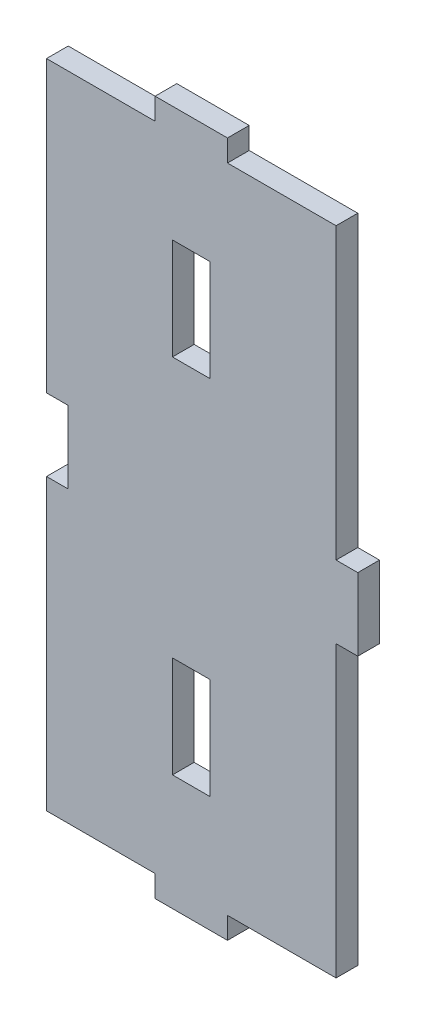
ISO-10303-21;
HEADER;
FILE_DESCRIPTION(('STEP AP214'),'2;1');
FILE_NAME('part.step','',(''),(''),'','','');
FILE_SCHEMA(('AUTOMOTIVE_DESIGN { 1 0 10303 214 1 1 1 1 }'));
ENDSEC;
DATA;
#1=APPLICATION_CONTEXT('core data for automotive mechanical design processes');
#2=APPLICATION_PROTOCOL_DEFINITION('international standard','automotive_design',2000,#1);
#3=PRODUCT_CONTEXT('',#1,'mechanical');
#4=PRODUCT('Part','Part','',(#3));
#5=PRODUCT_RELATED_PRODUCT_CATEGORY('part','',(#4));
#6=PRODUCT_DEFINITION_FORMATION('','',#4);
#7=PRODUCT_DEFINITION_CONTEXT('part definition',#1,'design');
#8=PRODUCT_DEFINITION('design','',#6,#7);
#9=PRODUCT_DEFINITION_SHAPE('','',#8);
#10=(LENGTH_UNIT() NAMED_UNIT(*) SI_UNIT(.MILLI.,.METRE.));
#11=(NAMED_UNIT(*) PLANE_ANGLE_UNIT() SI_UNIT($,.RADIAN.));
#12=(NAMED_UNIT(*) SI_UNIT($,.STERADIAN.) SOLID_ANGLE_UNIT());
#13=UNCERTAINTY_MEASURE_WITH_UNIT(LENGTH_MEASURE(1.E-05),#10,'distance_accuracy_value','');
#14=(GEOMETRIC_REPRESENTATION_CONTEXT(3) GLOBAL_UNCERTAINTY_ASSIGNED_CONTEXT((#13)) GLOBAL_UNIT_ASSIGNED_CONTEXT((#10,
#11,#12)) REPRESENTATION_CONTEXT('',''));
#15=CARTESIAN_POINT('',(0.,0.,0.));
#16=DIRECTION('',(0.,0.,1.));
#17=DIRECTION('',(1.,0.,0.));
#18=AXIS2_PLACEMENT_3D('',#15,#16,#17);
#19=CARTESIAN_POINT('',(0.,0.,3.));
#20=DIRECTION('',(0.,0.,-1.));
#21=DIRECTION('',(-1.,0.,0.));
#22=AXIS2_PLACEMENT_3D('',#19,#20,#21);
#23=PLANE('',#22);
#24=DIRECTION('',(0.,-1.,0.));
#25=VECTOR('',#24,1.);
#26=CARTESIAN_POINT('',(17.4000000000214,-17.8029528189074,3.));
#27=LINE('',#26,#25);
#28=CARTESIAN_POINT('',(17.4000000000214,-17.8029528189074,3.));
#29=VERTEX_POINT('',#28);
#30=CARTESIAN_POINT('',(17.4000000000214,-31.8029528189074,3.));
#31=VERTEX_POINT('',#30);
#32=EDGE_CURVE('E258',#29,#31,#27,.T.);
#33=ORIENTED_EDGE('',*,*,#32,.F.);
#34=DIRECTION('',(-1.,0.,0.));
#35=VECTOR('',#34,1.);
#36=CARTESIAN_POINT('',(17.4000000000214,-17.8029528189074,3.));
#37=LINE('',#36,#35);
#38=CARTESIAN_POINT('',(22.6000000000214,-17.8029528189074,3.));
#39=VERTEX_POINT('',#38);
#40=EDGE_CURVE('E266',#39,#29,#37,.T.);
#41=ORIENTED_EDGE('',*,*,#40,.F.);
#42=DIRECTION('',(0.,1.,0.));
#43=VECTOR('',#42,1.);
#44=CARTESIAN_POINT('',(22.6000000000214,-17.8029528189074,3.));
#45=LINE('',#44,#43);
#46=CARTESIAN_POINT('',(22.6000000000213,-31.8029528189074,3.));
#47=VERTEX_POINT('',#46);
#48=EDGE_CURVE('E263',#47,#39,#45,.T.);
#49=ORIENTED_EDGE('',*,*,#48,.F.);
#50=DIRECTION('',(1.,0.,0.));
#51=VECTOR('',#50,1.);
#52=CARTESIAN_POINT('',(17.4000000000214,-31.8029528189074,3.));
#53=LINE('',#52,#51);
#54=EDGE_CURVE('E260',#31,#47,#53,.T.);
#55=ORIENTED_EDGE('',*,*,#54,.F.);
#56=EDGE_LOOP('',(#33,#41,#49,#55));
#57=FACE_BOUND('',#56,.T.);
#58=DIRECTION('',(0.,-1.,0.));
#59=VECTOR('',#58,1.);
#60=CARTESIAN_POINT('',(2.13730942666412E-11,5.19704718109264,3.));
#61=LINE('',#60,#59);
#62=CARTESIAN_POINT('',(2.13730942666412E-11,45.1970471810926,3.));
#63=VERTEX_POINT('',#62);
#64=CARTESIAN_POINT('',(2.13730942666412E-11,5.19704718109264,3.));
#65=VERTEX_POINT('',#64);
#66=EDGE_CURVE('E289',#63,#65,#61,.T.);
#67=ORIENTED_EDGE('',*,*,#66,.T.);
#68=DIRECTION('',(1.,0.,0.));
#69=VECTOR('',#68,1.);
#70=CARTESIAN_POINT('',(3.00000000002137,5.19704718109264,3.));
#71=LINE('',#70,#69);
#72=CARTESIAN_POINT('',(3.00000000002137,5.19704718109264,3.));
#73=VERTEX_POINT('',#72);
#74=EDGE_CURVE('E292',#65,#73,#71,.T.);
#75=ORIENTED_EDGE('',*,*,#74,.T.);
#76=DIRECTION('',(0.,-1.,0.));
#77=VECTOR('',#76,1.);
#78=CARTESIAN_POINT('',(3.00000000002137,-4.80295281890736,3.));
#79=LINE('',#78,#77);
#80=CARTESIAN_POINT('',(3.00000000002137,-4.80295281890736,3.));
#81=VERTEX_POINT('',#80);
#82=EDGE_CURVE('E295',#73,#81,#79,.T.);
#83=ORIENTED_EDGE('',*,*,#82,.T.);
#84=DIRECTION('',(-1.,0.,0.));
#85=VECTOR('',#84,1.);
#86=CARTESIAN_POINT('',(2.13730942666412E-11,-4.80295281890736,3.));
#87=LINE('',#86,#85);
#88=CARTESIAN_POINT('',(2.13730942666412E-11,-4.80295281890736,3.));
#89=VERTEX_POINT('',#88);
#90=EDGE_CURVE('E297',#81,#89,#87,.T.);
#91=ORIENTED_EDGE('',*,*,#90,.T.);
#92=DIRECTION('',(0.,-1.,0.));
#93=VECTOR('',#92,1.);
#94=CARTESIAN_POINT('',(2.13730942666412E-11,-44.8029528189074,3.));
#95=LINE('',#94,#93);
#96=CARTESIAN_POINT('',(2.13730942666412E-11,-44.8029528189074,3.));
#97=VERTEX_POINT('',#96);
#98=EDGE_CURVE('E299',#89,#97,#95,.T.);
#99=ORIENTED_EDGE('',*,*,#98,.T.);
#100=DIRECTION('',(1.,0.,0.));
#101=VECTOR('',#100,1.);
#102=CARTESIAN_POINT('',(15.0000000000214,-44.8029528189074,3.));
#103=LINE('',#102,#101);
#104=CARTESIAN_POINT('',(15.0000000000214,-44.8029528189074,3.));
#105=VERTEX_POINT('',#104);
#106=EDGE_CURVE('E301',#97,#105,#103,.T.);
#107=ORIENTED_EDGE('',*,*,#106,.T.);
#108=DIRECTION('',(0.,-1.,0.));
#109=VECTOR('',#108,1.);
#110=CARTESIAN_POINT('',(15.0000000000214,-44.8029528189074,3.));
#111=LINE('',#110,#109);
#112=CARTESIAN_POINT('',(15.0000000000214,-47.8029528189074,3.));
#113=VERTEX_POINT('',#112);
#114=EDGE_CURVE('E303',#105,#113,#111,.T.);
#115=ORIENTED_EDGE('',*,*,#114,.T.);
#116=DIRECTION('',(1.,0.,0.));
#117=VECTOR('',#116,1.);
#118=CARTESIAN_POINT('',(15.0000000000214,-47.8029528189074,3.));
#119=LINE('',#118,#117);
#120=CARTESIAN_POINT('',(25.0000000000214,-47.8029528189074,3.));
#121=VERTEX_POINT('',#120);
#122=EDGE_CURVE('E305',#113,#121,#119,.T.);
#123=ORIENTED_EDGE('',*,*,#122,.T.);
#124=DIRECTION('',(0.,1.,0.));
#125=VECTOR('',#124,1.);
#126=CARTESIAN_POINT('',(25.0000000000214,-44.8029528189074,3.));
#127=LINE('',#126,#125);
#128=CARTESIAN_POINT('',(25.0000000000214,-44.8029528189074,3.));
#129=VERTEX_POINT('',#128);
#130=EDGE_CURVE('E307',#121,#129,#127,.T.);
#131=ORIENTED_EDGE('',*,*,#130,.T.);
#132=DIRECTION('',(1.,0.,0.));
#133=VECTOR('',#132,1.);
#134=CARTESIAN_POINT('',(40.0000000000214,-44.8029528189074,3.));
#135=LINE('',#134,#133);
#136=CARTESIAN_POINT('',(40.0000000000214,-44.8029528189074,3.));
#137=VERTEX_POINT('',#136);
#138=EDGE_CURVE('E309',#129,#137,#135,.T.);
#139=ORIENTED_EDGE('',*,*,#138,.T.);
#140=DIRECTION('',(0.,1.,0.));
#141=VECTOR('',#140,1.);
#142=CARTESIAN_POINT('',(40.0000000000214,-4.80295281890738,3.));
#143=LINE('',#142,#141);
#144=CARTESIAN_POINT('',(40.0000000000214,-4.80295281890738,3.));
#145=VERTEX_POINT('',#144);
#146=EDGE_CURVE('E311',#137,#145,#143,.T.);
#147=ORIENTED_EDGE('',*,*,#146,.T.);
#148=DIRECTION('',(1.,0.,0.));
#149=VECTOR('',#148,1.);
#150=CARTESIAN_POINT('',(40.0000000000214,-4.80295281890738,3.));
#151=LINE('',#150,#149);
#152=CARTESIAN_POINT('',(43.0000000000214,-4.80295281890738,3.));
#153=VERTEX_POINT('',#152);
#154=EDGE_CURVE('E313',#145,#153,#151,.T.);
#155=ORIENTED_EDGE('',*,*,#154,.T.);
#156=DIRECTION('',(0.,1.,0.));
#157=VECTOR('',#156,1.);
#158=CARTESIAN_POINT('',(43.0000000000214,-4.80295281890738,3.));
#159=LINE('',#158,#157);
#160=CARTESIAN_POINT('',(43.0000000000214,5.19704718109262,3.));
#161=VERTEX_POINT('',#160);
#162=EDGE_CURVE('E315',#153,#161,#159,.T.);
#163=ORIENTED_EDGE('',*,*,#162,.T.);
#164=DIRECTION('',(-1.,0.,0.));
#165=VECTOR('',#164,1.);
#166=CARTESIAN_POINT('',(40.0000000000214,5.19704718109262,3.));
#167=LINE('',#166,#165);
#168=CARTESIAN_POINT('',(40.0000000000214,5.19704718109262,3.));
#169=VERTEX_POINT('',#168);
#170=EDGE_CURVE('E317',#161,#169,#167,.T.);
#171=ORIENTED_EDGE('',*,*,#170,.T.);
#172=DIRECTION('',(0.,1.,0.));
#173=VECTOR('',#172,1.);
#174=CARTESIAN_POINT('',(40.0000000000214,45.1970471810926,3.));
#175=LINE('',#174,#173);
#176=CARTESIAN_POINT('',(40.0000000000214,45.1970471810926,3.));
#177=VERTEX_POINT('',#176);
#178=EDGE_CURVE('E319',#169,#177,#175,.T.);
#179=ORIENTED_EDGE('',*,*,#178,.T.);
#180=DIRECTION('',(-1.,0.,0.));
#181=VECTOR('',#180,1.);
#182=CARTESIAN_POINT('',(25.0000000000214,45.1970471810926,3.));
#183=LINE('',#182,#181);
#184=CARTESIAN_POINT('',(25.0000000000214,45.1970471810926,3.));
#185=VERTEX_POINT('',#184);
#186=EDGE_CURVE('E321',#177,#185,#183,.T.);
#187=ORIENTED_EDGE('',*,*,#186,.T.);
#188=DIRECTION('',(0.,1.,0.));
#189=VECTOR('',#188,1.);
#190=CARTESIAN_POINT('',(25.0000000000214,45.1970471810926,3.));
#191=LINE('',#190,#189);
#192=CARTESIAN_POINT('',(25.0000000000214,48.1970471810926,3.));
#193=VERTEX_POINT('',#192);
#194=EDGE_CURVE('E323',#185,#193,#191,.T.);
#195=ORIENTED_EDGE('',*,*,#194,.T.);
#196=DIRECTION('',(-1.,0.,0.));
#197=VECTOR('',#196,1.);
#198=CARTESIAN_POINT('',(15.0000000000214,48.1970471810926,3.));
#199=LINE('',#198,#197);
#200=CARTESIAN_POINT('',(15.0000000000214,48.1970471810926,3.));
#201=VERTEX_POINT('',#200);
#202=EDGE_CURVE('E325',#193,#201,#199,.T.);
#203=ORIENTED_EDGE('',*,*,#202,.T.);
#204=DIRECTION('',(0.,-1.,0.));
#205=VECTOR('',#204,1.);
#206=CARTESIAN_POINT('',(15.0000000000214,45.1970471810926,3.));
#207=LINE('',#206,#205);
#208=CARTESIAN_POINT('',(15.0000000000214,45.1970471810926,3.));
#209=VERTEX_POINT('',#208);
#210=EDGE_CURVE('E327',#201,#209,#207,.T.);
#211=ORIENTED_EDGE('',*,*,#210,.T.);
#212=DIRECTION('',(-1.,0.,0.));
#213=VECTOR('',#212,1.);
#214=CARTESIAN_POINT('',(2.13730942666412E-11,45.1970471810926,3.));
#215=LINE('',#214,#213);
#216=EDGE_CURVE('E329',#209,#63,#215,.T.);
#217=ORIENTED_EDGE('',*,*,#216,.T.);
#218=EDGE_LOOP('',(#67,#75,#83,#91,#99,#107,#115,#123,#131,#139,#147,#155,#163,#171,#179,#187,
#195,#203,#211,#217));
#219=FACE_BOUND('',#218,.T.);
#220=DIRECTION('',(0.,1.,0.));
#221=VECTOR('',#220,1.);
#222=CARTESIAN_POINT('',(22.6000000000214,18.1970471810926,3.));
#223=LINE('',#222,#221);
#224=CARTESIAN_POINT('',(22.6000000000214,18.1970471810926,3.));
#225=VERTEX_POINT('',#224);
#226=CARTESIAN_POINT('',(22.6000000000214,32.1970471810926,3.));
#227=VERTEX_POINT('',#226);
#228=EDGE_CURVE('E222',#225,#227,#223,.T.);
#229=ORIENTED_EDGE('',*,*,#228,.F.);
#230=DIRECTION('',(1.,0.,0.));
#231=VECTOR('',#230,1.);
#232=CARTESIAN_POINT('',(17.4000000000214,18.1970471810926,3.));
#233=LINE('',#232,#231);
#234=CARTESIAN_POINT('',(17.4000000000214,18.1970471810926,3.));
#235=VERTEX_POINT('',#234);
#236=EDGE_CURVE('E244',#235,#225,#233,.T.);
#237=ORIENTED_EDGE('',*,*,#236,.F.);
#238=DIRECTION('',(0.,-1.,0.));
#239=VECTOR('',#238,1.);
#240=CARTESIAN_POINT('',(17.4000000000214,18.1970471810926,3.));
#241=LINE('',#240,#239);
#242=CARTESIAN_POINT('',(17.4000000000214,32.1970471810926,3.));
#243=VERTEX_POINT('',#242);
#244=EDGE_CURVE('E242',#243,#235,#241,.T.);
#245=ORIENTED_EDGE('',*,*,#244,.F.);
#246=DIRECTION('',(-1.,0.,0.));
#247=VECTOR('',#246,1.);
#248=CARTESIAN_POINT('',(17.4000000000214,32.1970471810926,3.));
#249=LINE('',#248,#247);
#250=EDGE_CURVE('E230',#227,#243,#249,.T.);
#251=ORIENTED_EDGE('',*,*,#250,.F.);
#252=EDGE_LOOP('',(#229,#237,#245,#251));
#253=FACE_BOUND('',#252,.T.);
#254=ADVANCED_FACE('F37',(#57,#219,#253),#23,.F.);
#255=CARTESIAN_POINT('',(0.,0.,0.));
#256=DIRECTION('',(0.,0.,-1.));
#257=DIRECTION('',(-1.,0.,0.));
#258=AXIS2_PLACEMENT_3D('',#255,#256,#257);
#259=PLANE('',#258);
#260=DIRECTION('',(0.,-1.,0.));
#261=VECTOR('',#260,1.);
#262=CARTESIAN_POINT('',(2.13730942666412E-11,5.19704718109264,0.));
#263=LINE('',#262,#261);
#264=CARTESIAN_POINT('',(2.13730942666412E-11,45.1970471810926,0.));
#265=VERTEX_POINT('',#264);
#266=CARTESIAN_POINT('',(2.13730942666412E-11,5.19704718109264,0.));
#267=VERTEX_POINT('',#266);
#268=EDGE_CURVE('E288',#265,#267,#263,.T.);
#269=ORIENTED_EDGE('',*,*,#268,.F.);
#270=DIRECTION('',(-1.,0.,0.));
#271=VECTOR('',#270,1.);
#272=CARTESIAN_POINT('',(2.13730942666412E-11,45.1970471810926,0.));
#273=LINE('',#272,#271);
#274=CARTESIAN_POINT('',(15.0000000000214,45.1970471810926,0.));
#275=VERTEX_POINT('',#274);
#276=EDGE_CURVE('E293',#275,#265,#273,.T.);
#277=ORIENTED_EDGE('',*,*,#276,.F.);
#278=DIRECTION('',(0.,-1.,0.));
#279=VECTOR('',#278,1.);
#280=CARTESIAN_POINT('',(15.0000000000214,45.1970471810926,0.));
#281=LINE('',#280,#279);
#282=CARTESIAN_POINT('',(15.0000000000214,48.1970471810926,0.));
#283=VERTEX_POINT('',#282);
#284=EDGE_CURVE('E368',#283,#275,#281,.T.);
#285=ORIENTED_EDGE('',*,*,#284,.F.);
#286=DIRECTION('',(-1.,0.,0.));
#287=VECTOR('',#286,1.);
#288=CARTESIAN_POINT('',(15.0000000000214,48.1970471810926,0.));
#289=LINE('',#288,#287);
#290=CARTESIAN_POINT('',(25.0000000000214,48.1970471810926,0.));
#291=VERTEX_POINT('',#290);
#292=EDGE_CURVE('E366',#291,#283,#289,.T.);
#293=ORIENTED_EDGE('',*,*,#292,.F.);
#294=DIRECTION('',(0.,1.,0.));
#295=VECTOR('',#294,1.);
#296=CARTESIAN_POINT('',(25.0000000000214,45.1970471810926,0.));
#297=LINE('',#296,#295);
#298=CARTESIAN_POINT('',(25.0000000000214,45.1970471810926,0.));
#299=VERTEX_POINT('',#298);
#300=EDGE_CURVE('E364',#299,#291,#297,.T.);
#301=ORIENTED_EDGE('',*,*,#300,.F.);
#302=DIRECTION('',(-1.,0.,0.));
#303=VECTOR('',#302,1.);
#304=CARTESIAN_POINT('',(25.0000000000214,45.1970471810926,0.));
#305=LINE('',#304,#303);
#306=CARTESIAN_POINT('',(40.0000000000214,45.1970471810926,0.));
#307=VERTEX_POINT('',#306);
#308=EDGE_CURVE('E362',#307,#299,#305,.T.);
#309=ORIENTED_EDGE('',*,*,#308,.F.);
#310=DIRECTION('',(0.,1.,0.));
#311=VECTOR('',#310,1.);
#312=CARTESIAN_POINT('',(40.0000000000214,45.1970471810926,0.));
#313=LINE('',#312,#311);
#314=CARTESIAN_POINT('',(40.0000000000214,5.19704718109262,0.));
#315=VERTEX_POINT('',#314);
#316=EDGE_CURVE('E360',#315,#307,#313,.T.);
#317=ORIENTED_EDGE('',*,*,#316,.F.);
#318=DIRECTION('',(-1.,0.,0.));
#319=VECTOR('',#318,1.);
#320=CARTESIAN_POINT('',(40.0000000000214,5.19704718109262,0.));
#321=LINE('',#320,#319);
#322=CARTESIAN_POINT('',(43.0000000000214,5.19704718109262,0.));
#323=VERTEX_POINT('',#322);
#324=EDGE_CURVE('E358',#323,#315,#321,.T.);
#325=ORIENTED_EDGE('',*,*,#324,.F.);
#326=DIRECTION('',(0.,1.,0.));
#327=VECTOR('',#326,1.);
#328=CARTESIAN_POINT('',(43.0000000000214,-4.80295281890738,0.));
#329=LINE('',#328,#327);
#330=CARTESIAN_POINT('',(43.0000000000214,-4.80295281890738,0.));
#331=VERTEX_POINT('',#330);
#332=EDGE_CURVE('E356',#331,#323,#329,.T.);
#333=ORIENTED_EDGE('',*,*,#332,.F.);
#334=DIRECTION('',(1.,0.,0.));
#335=VECTOR('',#334,1.);
#336=CARTESIAN_POINT('',(40.0000000000214,-4.80295281890738,0.));
#337=LINE('',#336,#335);
#338=CARTESIAN_POINT('',(40.0000000000214,-4.80295281890738,0.));
#339=VERTEX_POINT('',#338);
#340=EDGE_CURVE('E354',#339,#331,#337,.T.);
#341=ORIENTED_EDGE('',*,*,#340,.F.);
#342=DIRECTION('',(0.,1.,0.));
#343=VECTOR('',#342,1.);
#344=CARTESIAN_POINT('',(40.0000000000214,-4.80295281890738,0.));
#345=LINE('',#344,#343);
#346=CARTESIAN_POINT('',(40.0000000000214,-44.8029528189074,0.));
#347=VERTEX_POINT('',#346);
#348=EDGE_CURVE('E352',#347,#339,#345,.T.);
#349=ORIENTED_EDGE('',*,*,#348,.F.);
#350=DIRECTION('',(1.,0.,0.));
#351=VECTOR('',#350,1.);
#352=CARTESIAN_POINT('',(40.0000000000214,-44.8029528189074,0.));
#353=LINE('',#352,#351);
#354=CARTESIAN_POINT('',(25.0000000000214,-44.8029528189074,0.));
#355=VERTEX_POINT('',#354);
#356=EDGE_CURVE('E350',#355,#347,#353,.T.);
#357=ORIENTED_EDGE('',*,*,#356,.F.);
#358=DIRECTION('',(0.,1.,0.));
#359=VECTOR('',#358,1.);
#360=CARTESIAN_POINT('',(25.0000000000214,-44.8029528189074,0.));
#361=LINE('',#360,#359);
#362=CARTESIAN_POINT('',(25.0000000000214,-47.8029528189074,0.));
#363=VERTEX_POINT('',#362);
#364=EDGE_CURVE('E348',#363,#355,#361,.T.);
#365=ORIENTED_EDGE('',*,*,#364,.F.);
#366=DIRECTION('',(1.,0.,0.));
#367=VECTOR('',#366,1.);
#368=CARTESIAN_POINT('',(15.0000000000214,-47.8029528189074,0.));
#369=LINE('',#368,#367);
#370=CARTESIAN_POINT('',(15.0000000000214,-47.8029528189074,0.));
#371=VERTEX_POINT('',#370);
#372=EDGE_CURVE('E346',#371,#363,#369,.T.);
#373=ORIENTED_EDGE('',*,*,#372,.F.);
#374=DIRECTION('',(0.,-1.,0.));
#375=VECTOR('',#374,1.);
#376=CARTESIAN_POINT('',(15.0000000000214,-44.8029528189074,0.));
#377=LINE('',#376,#375);
#378=CARTESIAN_POINT('',(15.0000000000214,-44.8029528189074,0.));
#379=VERTEX_POINT('',#378);
#380=EDGE_CURVE('E344',#379,#371,#377,.T.);
#381=ORIENTED_EDGE('',*,*,#380,.F.);
#382=DIRECTION('',(1.,0.,0.));
#383=VECTOR('',#382,1.);
#384=CARTESIAN_POINT('',(15.0000000000214,-44.8029528189074,0.));
#385=LINE('',#384,#383);
#386=CARTESIAN_POINT('',(2.13730942666412E-11,-44.8029528189074,0.));
#387=VERTEX_POINT('',#386);
#388=EDGE_CURVE('E342',#387,#379,#385,.T.);
#389=ORIENTED_EDGE('',*,*,#388,.F.);
#390=DIRECTION('',(0.,-1.,0.));
#391=VECTOR('',#390,1.);
#392=CARTESIAN_POINT('',(2.13730942666412E-11,-44.8029528189074,0.));
#393=LINE('',#392,#391);
#394=CARTESIAN_POINT('',(2.13730942666412E-11,-4.80295281890736,0.));
#395=VERTEX_POINT('',#394);
#396=EDGE_CURVE('E340',#395,#387,#393,.T.);
#397=ORIENTED_EDGE('',*,*,#396,.F.);
#398=DIRECTION('',(-1.,0.,0.));
#399=VECTOR('',#398,1.);
#400=CARTESIAN_POINT('',(2.13730942666412E-11,-4.80295281890736,0.));
#401=LINE('',#400,#399);
#402=CARTESIAN_POINT('',(3.00000000002137,-4.80295281890736,0.));
#403=VERTEX_POINT('',#402);
#404=EDGE_CURVE('E338',#403,#395,#401,.T.);
#405=ORIENTED_EDGE('',*,*,#404,.F.);
#406=DIRECTION('',(0.,-1.,0.));
#407=VECTOR('',#406,1.);
#408=CARTESIAN_POINT('',(3.00000000002137,-4.80295281890736,0.));
#409=LINE('',#408,#407);
#410=CARTESIAN_POINT('',(3.00000000002137,5.19704718109264,0.));
#411=VERTEX_POINT('',#410);
#412=EDGE_CURVE('E336',#411,#403,#409,.T.);
#413=ORIENTED_EDGE('',*,*,#412,.F.);
#414=DIRECTION('',(1.,0.,0.));
#415=VECTOR('',#414,1.);
#416=CARTESIAN_POINT('',(3.00000000002137,5.19704718109264,0.));
#417=LINE('',#416,#415);
#418=EDGE_CURVE('E334',#267,#411,#417,.T.);
#419=ORIENTED_EDGE('',*,*,#418,.F.);
#420=EDGE_LOOP('',(#269,#277,#285,#293,#301,#309,#317,#325,#333,#341,#349,#357,#365,#373,#381,
#389,#397,#405,#413,#419));
#421=FACE_BOUND('',#420,.T.);
#422=DIRECTION('',(-1.,0.,0.));
#423=VECTOR('',#422,1.);
#424=CARTESIAN_POINT('',(17.4000000000214,-17.8029528189074,0.));
#425=LINE('',#424,#423);
#426=CARTESIAN_POINT('',(22.6000000000214,-17.8029528189074,0.));
#427=VERTEX_POINT('',#426);
#428=CARTESIAN_POINT('',(17.4000000000214,-17.8029528189074,0.));
#429=VERTEX_POINT('',#428);
#430=EDGE_CURVE('E261',#427,#429,#425,.T.);
#431=ORIENTED_EDGE('',*,*,#430,.T.);
#432=DIRECTION('',(0.,-1.,0.));
#433=VECTOR('',#432,1.);
#434=CARTESIAN_POINT('',(17.4000000000214,-17.8029528189074,0.));
#435=LINE('',#434,#433);
#436=CARTESIAN_POINT('',(17.4000000000214,-31.8029528189074,0.));
#437=VERTEX_POINT('',#436);
#438=EDGE_CURVE('E238',#429,#437,#435,.T.);
#439=ORIENTED_EDGE('',*,*,#438,.T.);
#440=DIRECTION('',(1.,0.,0.));
#441=VECTOR('',#440,1.);
#442=CARTESIAN_POINT('',(17.4000000000214,-31.8029528189074,0.));
#443=LINE('',#442,#441);
#444=CARTESIAN_POINT('',(22.6000000000213,-31.8029528189074,0.));
#445=VERTEX_POINT('',#444);
#446=EDGE_CURVE('E271',#437,#445,#443,.T.);
#447=ORIENTED_EDGE('',*,*,#446,.T.);
#448=DIRECTION('',(0.,1.,0.));
#449=VECTOR('',#448,1.);
#450=CARTESIAN_POINT('',(22.6000000000214,-17.8029528189074,0.));
#451=LINE('',#450,#449);
#452=EDGE_CURVE('E274',#445,#427,#451,.T.);
#453=ORIENTED_EDGE('',*,*,#452,.T.);
#454=EDGE_LOOP('',(#431,#439,#447,#453));
#455=FACE_BOUND('',#454,.T.);
#456=DIRECTION('',(1.,0.,0.));
#457=VECTOR('',#456,1.);
#458=CARTESIAN_POINT('',(17.4000000000214,18.1970471810926,0.));
#459=LINE('',#458,#457);
#460=CARTESIAN_POINT('',(17.4000000000214,18.1970471810926,0.));
#461=VERTEX_POINT('',#460);
#462=CARTESIAN_POINT('',(22.6000000000214,18.1970471810926,0.));
#463=VERTEX_POINT('',#462);
#464=EDGE_CURVE('E231',#461,#463,#459,.T.);
#465=ORIENTED_EDGE('',*,*,#464,.T.);
#466=DIRECTION('',(0.,1.,0.));
#467=VECTOR('',#466,1.);
#468=CARTESIAN_POINT('',(22.6000000000214,18.1970471810926,0.));
#469=LINE('',#468,#467);
#470=CARTESIAN_POINT('',(22.6000000000214,32.1970471810926,0.));
#471=VERTEX_POINT('',#470);
#472=EDGE_CURVE('E60',#463,#471,#469,.T.);
#473=ORIENTED_EDGE('',*,*,#472,.T.);
#474=DIRECTION('',(-1.,0.,0.));
#475=VECTOR('',#474,1.);
#476=CARTESIAN_POINT('',(17.4000000000214,32.1970471810926,0.));
#477=LINE('',#476,#475);
#478=CARTESIAN_POINT('',(17.4000000000214,32.1970471810926,0.));
#479=VERTEX_POINT('',#478);
#480=EDGE_CURVE('E237',#471,#479,#477,.T.);
#481=ORIENTED_EDGE('',*,*,#480,.T.);
#482=DIRECTION('',(0.,-1.,0.));
#483=VECTOR('',#482,1.);
#484=CARTESIAN_POINT('',(17.4000000000214,18.1970471810926,0.));
#485=LINE('',#484,#483);
#486=EDGE_CURVE('E250',#479,#461,#485,.T.);
#487=ORIENTED_EDGE('',*,*,#486,.T.);
#488=EDGE_LOOP('',(#465,#473,#481,#487));
#489=FACE_BOUND('',#488,.T.);
#490=ADVANCED_FACE('F434',(#421,#455,#489),#259,.T.);
#491=CARTESIAN_POINT('',(2.13730942666412E-11,5.19704718109264,3.));
#492=DIRECTION('',(1.,0.,0.));
#493=DIRECTION('',(0.,0.,-1.));
#494=AXIS2_PLACEMENT_3D('',#491,#492,#493);
#495=PLANE('',#494);
#496=ORIENTED_EDGE('',*,*,#268,.T.);
#497=DIRECTION('',(0.,0.,-1.));
#498=VECTOR('',#497,1.);
#499=CARTESIAN_POINT('',(2.13730942666412E-11,5.19704718109264,3.));
#500=LINE('',#499,#498);
#501=EDGE_CURVE('E11',#65,#267,#500,.T.);
#502=ORIENTED_EDGE('',*,*,#501,.F.);
#503=ORIENTED_EDGE('',*,*,#66,.F.);
#504=DIRECTION('',(0.,0.,-1.));
#505=VECTOR('',#504,1.);
#506=CARTESIAN_POINT('',(2.13730942666412E-11,45.1970471810926,3.));
#507=LINE('',#506,#505);
#508=EDGE_CURVE('E331',#63,#265,#507,.T.);
#509=ORIENTED_EDGE('',*,*,#508,.T.);
#510=EDGE_LOOP('',(#496,#502,#503,#509));
#511=FACE_BOUND('',#510,.T.);
#512=ADVANCED_FACE('F39',(#511),#495,.F.);
#513=CARTESIAN_POINT('',(3.00000000002137,5.19704718109264,3.));
#514=DIRECTION('',(0.,1.,0.));
#515=DIRECTION('',(0.,0.,1.));
#516=AXIS2_PLACEMENT_3D('',#513,#514,#515);
#517=PLANE('',#516);
#518=ORIENTED_EDGE('',*,*,#418,.T.);
#519=DIRECTION('',(0.,0.,-1.));
#520=VECTOR('',#519,1.);
#521=CARTESIAN_POINT('',(3.00000000002137,5.19704718109264,3.));
#522=LINE('',#521,#520);
#523=EDGE_CURVE('E45',#73,#411,#522,.T.);
#524=ORIENTED_EDGE('',*,*,#523,.F.);
#525=ORIENTED_EDGE('',*,*,#74,.F.);
#526=ORIENTED_EDGE('',*,*,#501,.T.);
#527=EDGE_LOOP('',(#518,#524,#525,#526));
#528=FACE_BOUND('',#527,.T.);
#529=ADVANCED_FACE('F451',(#528),#517,.F.);
#530=CARTESIAN_POINT('',(3.00000000002137,-4.80295281890736,3.));
#531=DIRECTION('',(1.,0.,0.));
#532=DIRECTION('',(0.,0.,-1.));
#533=AXIS2_PLACEMENT_3D('',#530,#531,#532);
#534=PLANE('',#533);
#535=ORIENTED_EDGE('',*,*,#412,.T.);
#536=DIRECTION('',(0.,0.,-1.));
#537=VECTOR('',#536,1.);
#538=CARTESIAN_POINT('',(3.00000000002137,-4.80295281890736,3.));
#539=LINE('',#538,#537);
#540=EDGE_CURVE('E421',#81,#403,#539,.T.);
#541=ORIENTED_EDGE('',*,*,#540,.F.);
#542=ORIENTED_EDGE('',*,*,#82,.F.);
#543=ORIENTED_EDGE('',*,*,#523,.T.);
#544=EDGE_LOOP('',(#535,#541,#542,#543));
#545=FACE_BOUND('',#544,.T.);
#546=ADVANCED_FACE('F428',(#545),#534,.F.);
#547=CARTESIAN_POINT('',(2.13730942666412E-11,-4.80295281890736,3.));
#548=DIRECTION('',(0.,-1.,0.));
#549=DIRECTION('',(1.,0.,0.));
#550=AXIS2_PLACEMENT_3D('',#547,#548,#549);
#551=PLANE('',#550);
#552=ORIENTED_EDGE('',*,*,#404,.T.);
#553=DIRECTION('',(0.,0.,-1.));
#554=VECTOR('',#553,1.);
#555=CARTESIAN_POINT('',(2.13730942666412E-11,-4.80295281890736,3.));
#556=LINE('',#555,#554);
#557=EDGE_CURVE('E418',#89,#395,#556,.T.);
#558=ORIENTED_EDGE('',*,*,#557,.F.);
#559=ORIENTED_EDGE('',*,*,#90,.F.);
#560=ORIENTED_EDGE('',*,*,#540,.T.);
#561=EDGE_LOOP('',(#552,#558,#559,#560));
#562=FACE_BOUND('',#561,.T.);
#563=ADVANCED_FACE('F440',(#562),#551,.F.);
#564=CARTESIAN_POINT('',(2.13730942666412E-11,-44.8029528189074,3.));
#565=DIRECTION('',(1.,0.,0.));
#566=DIRECTION('',(0.,0.,-1.));
#567=AXIS2_PLACEMENT_3D('',#564,#565,#566);
#568=PLANE('',#567);
#569=ORIENTED_EDGE('',*,*,#396,.T.);
#570=DIRECTION('',(0.,0.,-1.));
#571=VECTOR('',#570,1.);
#572=CARTESIAN_POINT('',(2.13730942666412E-11,-44.8029528189074,3.));
#573=LINE('',#572,#571);
#574=EDGE_CURVE('E415',#97,#387,#573,.T.);
#575=ORIENTED_EDGE('',*,*,#574,.F.);
#576=ORIENTED_EDGE('',*,*,#98,.F.);
#577=ORIENTED_EDGE('',*,*,#557,.T.);
#578=EDGE_LOOP('',(#569,#575,#576,#577));
#579=FACE_BOUND('',#578,.T.);
#580=ADVANCED_FACE('F444',(#579),#568,.F.);
#581=CARTESIAN_POINT('',(15.0000000000214,-44.8029528189074,3.));
#582=DIRECTION('',(0.,1.,0.));
#583=DIRECTION('',(-1.,0.,0.));
#584=AXIS2_PLACEMENT_3D('',#581,#582,#583);
#585=PLANE('',#584);
#586=ORIENTED_EDGE('',*,*,#388,.T.);
#587=DIRECTION('',(0.,0.,-1.));
#588=VECTOR('',#587,1.);
#589=CARTESIAN_POINT('',(15.0000000000214,-44.8029528189074,3.));
#590=LINE('',#589,#588);
#591=EDGE_CURVE('E412',#105,#379,#590,.T.);
#592=ORIENTED_EDGE('',*,*,#591,.F.);
#593=ORIENTED_EDGE('',*,*,#106,.F.);
#594=ORIENTED_EDGE('',*,*,#574,.T.);
#595=EDGE_LOOP('',(#586,#592,#593,#594));
#596=FACE_BOUND('',#595,.T.);
#597=ADVANCED_FACE('F524',(#596),#585,.F.);
#598=CARTESIAN_POINT('',(15.0000000000214,-44.8029528189074,3.));
#599=DIRECTION('',(1.,0.,0.));
#600=DIRECTION('',(0.,0.,-1.));
#601=AXIS2_PLACEMENT_3D('',#598,#599,#600);
#602=PLANE('',#601);
#603=ORIENTED_EDGE('',*,*,#380,.T.);
#604=DIRECTION('',(0.,0.,-1.));
#605=VECTOR('',#604,1.);
#606=CARTESIAN_POINT('',(15.0000000000214,-47.8029528189074,3.));
#607=LINE('',#606,#605);
#608=EDGE_CURVE('E409',#113,#371,#607,.T.);
#609=ORIENTED_EDGE('',*,*,#608,.F.);
#610=ORIENTED_EDGE('',*,*,#114,.F.);
#611=ORIENTED_EDGE('',*,*,#591,.T.);
#612=EDGE_LOOP('',(#603,#609,#610,#611));
#613=FACE_BOUND('',#612,.T.);
#614=ADVANCED_FACE('F522',(#613),#602,.F.);
#615=CARTESIAN_POINT('',(15.0000000000214,-47.8029528189074,3.));
#616=DIRECTION('',(0.,1.,0.));
#617=DIRECTION('',(0.,0.,1.));
#618=AXIS2_PLACEMENT_3D('',#615,#616,#617);
#619=PLANE('',#618);
#620=ORIENTED_EDGE('',*,*,#372,.T.);
#621=DIRECTION('',(0.,0.,-1.));
#622=VECTOR('',#621,1.);
#623=CARTESIAN_POINT('',(25.0000000000214,-47.8029528189074,3.));
#624=LINE('',#623,#622);
#625=EDGE_CURVE('E406',#121,#363,#624,.T.);
#626=ORIENTED_EDGE('',*,*,#625,.F.);
#627=ORIENTED_EDGE('',*,*,#122,.F.);
#628=ORIENTED_EDGE('',*,*,#608,.T.);
#629=EDGE_LOOP('',(#620,#626,#627,#628));
#630=FACE_BOUND('',#629,.T.);
#631=ADVANCED_FACE('F517',(#630),#619,.F.);
#632=CARTESIAN_POINT('',(25.0000000000214,-44.8029528189074,3.));
#633=DIRECTION('',(-1.,0.,0.));
#634=DIRECTION('',(0.,0.,1.));
#635=AXIS2_PLACEMENT_3D('',#632,#633,#634);
#636=PLANE('',#635);
#637=ORIENTED_EDGE('',*,*,#364,.T.);
#638=DIRECTION('',(0.,0.,-1.));
#639=VECTOR('',#638,1.);
#640=CARTESIAN_POINT('',(25.0000000000214,-44.8029528189074,3.));
#641=LINE('',#640,#639);
#642=EDGE_CURVE('E403',#129,#355,#641,.T.);
#643=ORIENTED_EDGE('',*,*,#642,.F.);
#644=ORIENTED_EDGE('',*,*,#130,.F.);
#645=ORIENTED_EDGE('',*,*,#625,.T.);
#646=EDGE_LOOP('',(#637,#643,#644,#645));
#647=FACE_BOUND('',#646,.T.);
#648=ADVANCED_FACE('F512',(#647),#636,.F.);
#649=CARTESIAN_POINT('',(40.0000000000214,-44.8029528189074,3.));
#650=DIRECTION('',(0.,1.,0.));
#651=DIRECTION('',(-1.,0.,0.));
#652=AXIS2_PLACEMENT_3D('',#649,#650,#651);
#653=PLANE('',#652);
#654=ORIENTED_EDGE('',*,*,#356,.T.);
#655=DIRECTION('',(0.,0.,-1.));
#656=VECTOR('',#655,1.);
#657=CARTESIAN_POINT('',(40.0000000000214,-44.8029528189074,3.));
#658=LINE('',#657,#656);
#659=EDGE_CURVE('E400',#137,#347,#658,.T.);
#660=ORIENTED_EDGE('',*,*,#659,.F.);
#661=ORIENTED_EDGE('',*,*,#138,.F.);
#662=ORIENTED_EDGE('',*,*,#642,.T.);
#663=EDGE_LOOP('',(#654,#660,#661,#662));
#664=FACE_BOUND('',#663,.T.);
#665=ADVANCED_FACE('F508',(#664),#653,.F.);
#666=CARTESIAN_POINT('',(40.0000000000214,-4.80295281890738,3.));
#667=DIRECTION('',(-1.,0.,0.));
#668=DIRECTION('',(0.,0.,1.));
#669=AXIS2_PLACEMENT_3D('',#666,#667,#668);
#670=PLANE('',#669);
#671=ORIENTED_EDGE('',*,*,#348,.T.);
#672=DIRECTION('',(0.,0.,-1.));
#673=VECTOR('',#672,1.);
#674=CARTESIAN_POINT('',(40.0000000000214,-4.80295281890738,3.));
#675=LINE('',#674,#673);
#676=EDGE_CURVE('E397',#145,#339,#675,.T.);
#677=ORIENTED_EDGE('',*,*,#676,.F.);
#678=ORIENTED_EDGE('',*,*,#146,.F.);
#679=ORIENTED_EDGE('',*,*,#659,.T.);
#680=EDGE_LOOP('',(#671,#677,#678,#679));
#681=FACE_BOUND('',#680,.T.);
#682=ADVANCED_FACE('F503',(#681),#670,.F.);
#683=CARTESIAN_POINT('',(40.0000000000214,-4.80295281890738,3.));
#684=DIRECTION('',(0.,1.,0.));
#685=DIRECTION('',(-1.,0.,0.));
#686=AXIS2_PLACEMENT_3D('',#683,#684,#685);
#687=PLANE('',#686);
#688=ORIENTED_EDGE('',*,*,#340,.T.);
#689=DIRECTION('',(0.,0.,-1.));
#690=VECTOR('',#689,1.);
#691=CARTESIAN_POINT('',(43.0000000000214,-4.80295281890738,3.));
#692=LINE('',#691,#690);
#693=EDGE_CURVE('E394',#153,#331,#692,.T.);
#694=ORIENTED_EDGE('',*,*,#693,.F.);
#695=ORIENTED_EDGE('',*,*,#154,.F.);
#696=ORIENTED_EDGE('',*,*,#676,.T.);
#697=EDGE_LOOP('',(#688,#694,#695,#696));
#698=FACE_BOUND('',#697,.T.);
#699=ADVANCED_FACE('F497',(#698),#687,.F.);
#700=CARTESIAN_POINT('',(43.0000000000214,-4.80295281890738,3.));
#701=DIRECTION('',(-1.,0.,0.));
#702=DIRECTION('',(0.,0.,1.));
#703=AXIS2_PLACEMENT_3D('',#700,#701,#702);
#704=PLANE('',#703);
#705=ORIENTED_EDGE('',*,*,#332,.T.);
#706=DIRECTION('',(0.,0.,-1.));
#707=VECTOR('',#706,1.);
#708=CARTESIAN_POINT('',(43.0000000000214,5.19704718109262,3.));
#709=LINE('',#708,#707);
#710=EDGE_CURVE('E391',#161,#323,#709,.T.);
#711=ORIENTED_EDGE('',*,*,#710,.F.);
#712=ORIENTED_EDGE('',*,*,#162,.F.);
#713=ORIENTED_EDGE('',*,*,#693,.T.);
#714=EDGE_LOOP('',(#705,#711,#712,#713));
#715=FACE_BOUND('',#714,.T.);
#716=ADVANCED_FACE('F493',(#715),#704,.F.);
#717=CARTESIAN_POINT('',(40.0000000000214,5.19704718109262,3.));
#718=DIRECTION('',(0.,-1.,0.));
#719=DIRECTION('',(1.,0.,0.));
#720=AXIS2_PLACEMENT_3D('',#717,#718,#719);
#721=PLANE('',#720);
#722=ORIENTED_EDGE('',*,*,#324,.T.);
#723=DIRECTION('',(0.,0.,-1.));
#724=VECTOR('',#723,1.);
#725=CARTESIAN_POINT('',(40.0000000000214,5.19704718109262,3.));
#726=LINE('',#725,#724);
#727=EDGE_CURVE('E388',#169,#315,#726,.T.);
#728=ORIENTED_EDGE('',*,*,#727,.F.);
#729=ORIENTED_EDGE('',*,*,#170,.F.);
#730=ORIENTED_EDGE('',*,*,#710,.T.);
#731=EDGE_LOOP('',(#722,#728,#729,#730));
#732=FACE_BOUND('',#731,.T.);
#733=ADVANCED_FACE('F488',(#732),#721,.F.);
#734=CARTESIAN_POINT('',(40.0000000000214,45.1970471810926,3.));
#735=DIRECTION('',(-1.,0.,0.));
#736=DIRECTION('',(0.,0.,1.));
#737=AXIS2_PLACEMENT_3D('',#734,#735,#736);
#738=PLANE('',#737);
#739=ORIENTED_EDGE('',*,*,#316,.T.);
#740=DIRECTION('',(0.,0.,-1.));
#741=VECTOR('',#740,1.);
#742=CARTESIAN_POINT('',(40.0000000000214,45.1970471810926,3.));
#743=LINE('',#742,#741);
#744=EDGE_CURVE('E385',#177,#307,#743,.T.);
#745=ORIENTED_EDGE('',*,*,#744,.F.);
#746=ORIENTED_EDGE('',*,*,#178,.F.);
#747=ORIENTED_EDGE('',*,*,#727,.T.);
#748=EDGE_LOOP('',(#739,#745,#746,#747));
#749=FACE_BOUND('',#748,.T.);
#750=ADVANCED_FACE('F482',(#749),#738,.F.);
#751=CARTESIAN_POINT('',(25.0000000000214,45.1970471810926,3.));
#752=DIRECTION('',(0.,-1.,0.));
#753=DIRECTION('',(0.,0.,-1.));
#754=AXIS2_PLACEMENT_3D('',#751,#752,#753);
#755=PLANE('',#754);
#756=ORIENTED_EDGE('',*,*,#308,.T.);
#757=DIRECTION('',(0.,0.,-1.));
#758=VECTOR('',#757,1.);
#759=CARTESIAN_POINT('',(25.0000000000214,45.1970471810926,3.));
#760=LINE('',#759,#758);
#761=EDGE_CURVE('E382',#185,#299,#760,.T.);
#762=ORIENTED_EDGE('',*,*,#761,.F.);
#763=ORIENTED_EDGE('',*,*,#186,.F.);
#764=ORIENTED_EDGE('',*,*,#744,.T.);
#765=EDGE_LOOP('',(#756,#762,#763,#764));
#766=FACE_BOUND('',#765,.T.);
#767=ADVANCED_FACE('F478',(#766),#755,.F.);
#768=CARTESIAN_POINT('',(25.0000000000214,45.1970471810926,3.));
#769=DIRECTION('',(-1.,0.,0.));
#770=DIRECTION('',(0.,0.,1.));
#771=AXIS2_PLACEMENT_3D('',#768,#769,#770);
#772=PLANE('',#771);
#773=ORIENTED_EDGE('',*,*,#300,.T.);
#774=DIRECTION('',(0.,0.,-1.));
#775=VECTOR('',#774,1.);
#776=CARTESIAN_POINT('',(25.0000000000214,48.1970471810926,3.));
#777=LINE('',#776,#775);
#778=EDGE_CURVE('E379',#193,#291,#777,.T.);
#779=ORIENTED_EDGE('',*,*,#778,.F.);
#780=ORIENTED_EDGE('',*,*,#194,.F.);
#781=ORIENTED_EDGE('',*,*,#761,.T.);
#782=EDGE_LOOP('',(#773,#779,#780,#781));
#783=FACE_BOUND('',#782,.T.);
#784=ADVANCED_FACE('F473',(#783),#772,.F.);
#785=CARTESIAN_POINT('',(15.0000000000214,48.1970471810926,3.));
#786=DIRECTION('',(0.,-1.,0.));
#787=DIRECTION('',(0.,0.,-1.));
#788=AXIS2_PLACEMENT_3D('',#785,#786,#787);
#789=PLANE('',#788);
#790=ORIENTED_EDGE('',*,*,#292,.T.);
#791=DIRECTION('',(0.,0.,-1.));
#792=VECTOR('',#791,1.);
#793=CARTESIAN_POINT('',(15.0000000000214,48.1970471810926,3.));
#794=LINE('',#793,#792);
#795=EDGE_CURVE('E376',#201,#283,#794,.T.);
#796=ORIENTED_EDGE('',*,*,#795,.F.);
#797=ORIENTED_EDGE('',*,*,#202,.F.);
#798=ORIENTED_EDGE('',*,*,#778,.T.);
#799=EDGE_LOOP('',(#790,#796,#797,#798));
#800=FACE_BOUND('',#799,.T.);
#801=ADVANCED_FACE('F467',(#800),#789,.F.);
#802=CARTESIAN_POINT('',(15.0000000000214,45.1970471810926,3.));
#803=DIRECTION('',(1.,0.,0.));
#804=DIRECTION('',(0.,0.,-1.));
#805=AXIS2_PLACEMENT_3D('',#802,#803,#804);
#806=PLANE('',#805);
#807=ORIENTED_EDGE('',*,*,#284,.T.);
#808=DIRECTION('',(0.,0.,-1.));
#809=VECTOR('',#808,1.);
#810=CARTESIAN_POINT('',(15.0000000000214,45.1970471810926,3.));
#811=LINE('',#810,#809);
#812=EDGE_CURVE('E373',#209,#275,#811,.T.);
#813=ORIENTED_EDGE('',*,*,#812,.F.);
#814=ORIENTED_EDGE('',*,*,#210,.F.);
#815=ORIENTED_EDGE('',*,*,#795,.T.);
#816=EDGE_LOOP('',(#807,#813,#814,#815));
#817=FACE_BOUND('',#816,.T.);
#818=ADVANCED_FACE('F463',(#817),#806,.F.);
#819=CARTESIAN_POINT('',(2.13730942666412E-11,45.1970471810926,3.));
#820=DIRECTION('',(0.,-1.,0.));
#821=DIRECTION('',(0.,0.,-1.));
#822=AXIS2_PLACEMENT_3D('',#819,#820,#821);
#823=PLANE('',#822);
#824=ORIENTED_EDGE('',*,*,#276,.T.);
#825=ORIENTED_EDGE('',*,*,#508,.F.);
#826=ORIENTED_EDGE('',*,*,#216,.F.);
#827=ORIENTED_EDGE('',*,*,#812,.T.);
#828=EDGE_LOOP('',(#824,#825,#826,#827));
#829=FACE_BOUND('',#828,.T.);
#830=ADVANCED_FACE('F458',(#829),#823,.F.);
#831=CARTESIAN_POINT('',(17.4000000000214,-17.8029528189074,3.));
#832=DIRECTION('',(1.,0.,0.));
#833=DIRECTION('',(0.,1.,0.));
#834=AXIS2_PLACEMENT_3D('',#831,#832,#833);
#835=PLANE('',#834);
#836=ORIENTED_EDGE('',*,*,#438,.F.);
#837=DIRECTION('',(0.,0.,-1.));
#838=VECTOR('',#837,1.);
#839=CARTESIAN_POINT('',(17.4000000000214,-17.8029528189074,3.));
#840=LINE('',#839,#838);
#841=EDGE_CURVE('E268',#29,#429,#840,.T.);
#842=ORIENTED_EDGE('',*,*,#841,.F.);
#843=ORIENTED_EDGE('',*,*,#32,.T.);
#844=DIRECTION('',(0.,0.,-1.));
#845=VECTOR('',#844,1.);
#846=CARTESIAN_POINT('',(17.4000000000214,-31.8029528189074,3.));
#847=LINE('',#846,#845);
#848=EDGE_CURVE('E285',#31,#437,#847,.T.);
#849=ORIENTED_EDGE('',*,*,#848,.T.);
#850=EDGE_LOOP('',(#836,#842,#843,#849));
#851=FACE_BOUND('',#850,.T.);
#852=ADVANCED_FACE('F542',(#851),#835,.T.);
#853=CARTESIAN_POINT('',(17.4000000000214,-31.8029528189074,3.));
#854=DIRECTION('',(0.,1.,0.));
#855=DIRECTION('',(0.,0.,1.));
#856=AXIS2_PLACEMENT_3D('',#853,#854,#855);
#857=PLANE('',#856);
#858=ORIENTED_EDGE('',*,*,#446,.F.);
#859=ORIENTED_EDGE('',*,*,#848,.F.);
#860=ORIENTED_EDGE('',*,*,#54,.T.);
#861=DIRECTION('',(0.,0.,-1.));
#862=VECTOR('',#861,1.);
#863=CARTESIAN_POINT('',(22.6000000000213,-31.8029528189074,3.));
#864=LINE('',#863,#862);
#865=EDGE_CURVE('E283',#47,#445,#864,.T.);
#866=ORIENTED_EDGE('',*,*,#865,.T.);
#867=EDGE_LOOP('',(#858,#859,#860,#866));
#868=FACE_BOUND('',#867,.T.);
#869=ADVANCED_FACE('F628',(#868),#857,.T.);
#870=CARTESIAN_POINT('',(22.6000000000214,-17.8029528189074,3.));
#871=DIRECTION('',(-1.,0.,0.));
#872=DIRECTION('',(0.,-1.,0.));
#873=AXIS2_PLACEMENT_3D('',#870,#871,#872);
#874=PLANE('',#873);
#875=ORIENTED_EDGE('',*,*,#452,.F.);
#876=ORIENTED_EDGE('',*,*,#865,.F.);
#877=ORIENTED_EDGE('',*,*,#48,.T.);
#878=DIRECTION('',(0.,0.,-1.));
#879=VECTOR('',#878,1.);
#880=CARTESIAN_POINT('',(22.6000000000214,-17.8029528189074,3.));
#881=LINE('',#880,#879);
#882=EDGE_CURVE('E281',#39,#427,#881,.T.);
#883=ORIENTED_EDGE('',*,*,#882,.T.);
#884=EDGE_LOOP('',(#875,#876,#877,#883));
#885=FACE_BOUND('',#884,.T.);
#886=ADVANCED_FACE('F635',(#885),#874,.T.);
#887=CARTESIAN_POINT('',(17.4000000000214,-17.8029528189074,3.));
#888=DIRECTION('',(0.,-1.,0.));
#889=DIRECTION('',(1.,0.,0.));
#890=AXIS2_PLACEMENT_3D('',#887,#888,#889);
#891=PLANE('',#890);
#892=ORIENTED_EDGE('',*,*,#430,.F.);
#893=ORIENTED_EDGE('',*,*,#882,.F.);
#894=ORIENTED_EDGE('',*,*,#40,.T.);
#895=ORIENTED_EDGE('',*,*,#841,.T.);
#896=EDGE_LOOP('',(#892,#893,#894,#895));
#897=FACE_BOUND('',#896,.T.);
#898=ADVANCED_FACE('F642',(#897),#891,.T.);
#899=CARTESIAN_POINT('',(22.6000000000214,18.1970471810926,3.));
#900=DIRECTION('',(-1.,0.,0.));
#901=DIRECTION('',(0.,0.,1.));
#902=AXIS2_PLACEMENT_3D('',#899,#900,#901);
#903=PLANE('',#902);
#904=ORIENTED_EDGE('',*,*,#472,.F.);
#905=DIRECTION('',(0.,0.,-1.));
#906=VECTOR('',#905,1.);
#907=CARTESIAN_POINT('',(22.6000000000214,18.1970471810926,3.));
#908=LINE('',#907,#906);
#909=EDGE_CURVE('E226',#225,#463,#908,.T.);
#910=ORIENTED_EDGE('',*,*,#909,.F.);
#911=ORIENTED_EDGE('',*,*,#228,.T.);
#912=DIRECTION('',(0.,0.,-1.));
#913=VECTOR('',#912,1.);
#914=CARTESIAN_POINT('',(22.6000000000214,32.1970471810926,3.));
#915=LINE('',#914,#913);
#916=EDGE_CURVE('E225',#227,#471,#915,.T.);
#917=ORIENTED_EDGE('',*,*,#916,.T.);
#918=EDGE_LOOP('',(#904,#910,#911,#917));
#919=FACE_BOUND('',#918,.T.);
#920=ADVANCED_FACE('F224',(#919),#903,.T.);
#921=CARTESIAN_POINT('',(17.4000000000214,32.1970471810926,3.));
#922=DIRECTION('',(0.,-1.,0.));
#923=DIRECTION('',(0.,0.,-1.));
#924=AXIS2_PLACEMENT_3D('',#921,#922,#923);
#925=PLANE('',#924);
#926=ORIENTED_EDGE('',*,*,#480,.F.);
#927=ORIENTED_EDGE('',*,*,#916,.F.);
#928=ORIENTED_EDGE('',*,*,#250,.T.);
#929=DIRECTION('',(0.,0.,-1.));
#930=VECTOR('',#929,1.);
#931=CARTESIAN_POINT('',(17.4000000000214,32.1970471810926,3.));
#932=LINE('',#931,#930);
#933=EDGE_CURVE('E239',#243,#479,#932,.T.);
#934=ORIENTED_EDGE('',*,*,#933,.T.);
#935=EDGE_LOOP('',(#926,#927,#928,#934));
#936=FACE_BOUND('',#935,.T.);
#937=ADVANCED_FACE('F234',(#936),#925,.T.);
#938=CARTESIAN_POINT('',(17.4000000000214,18.1970471810926,3.));
#939=DIRECTION('',(1.,0.,0.));
#940=DIRECTION('',(0.,0.,-1.));
#941=AXIS2_PLACEMENT_3D('',#938,#939,#940);
#942=PLANE('',#941);
#943=ORIENTED_EDGE('',*,*,#486,.F.);
#944=ORIENTED_EDGE('',*,*,#933,.F.);
#945=ORIENTED_EDGE('',*,*,#244,.T.);
#946=DIRECTION('',(0.,0.,-1.));
#947=VECTOR('',#946,1.);
#948=CARTESIAN_POINT('',(17.4000000000214,18.1970471810926,3.));
#949=LINE('',#948,#947);
#950=EDGE_CURVE('E52',#235,#461,#949,.T.);
#951=ORIENTED_EDGE('',*,*,#950,.T.);
#952=EDGE_LOOP('',(#943,#944,#945,#951));
#953=FACE_BOUND('',#952,.T.);
#954=ADVANCED_FACE('F663',(#953),#942,.T.);
#955=CARTESIAN_POINT('',(17.4000000000214,18.1970471810926,3.));
#956=DIRECTION('',(0.,1.,0.));
#957=DIRECTION('',(0.,0.,1.));
#958=AXIS2_PLACEMENT_3D('',#955,#956,#957);
#959=PLANE('',#958);
#960=ORIENTED_EDGE('',*,*,#464,.F.);
#961=ORIENTED_EDGE('',*,*,#950,.F.);
#962=ORIENTED_EDGE('',*,*,#236,.T.);
#963=ORIENTED_EDGE('',*,*,#909,.T.);
#964=EDGE_LOOP('',(#960,#961,#962,#963));
#965=FACE_BOUND('',#964,.T.);
#966=ADVANCED_FACE('F670',(#965),#959,.T.);
#967=CLOSED_SHELL('',(#254,#490,#512,#529,#546,#563,#580,#597,#614,#631,#648,#665,#682,#699,
#716,#733,#750,#767,#784,#801,#818,#830,#852,#869,#886,#898,#920,#937,#954,#966));
#968=MANIFOLD_SOLID_BREP('B2',#967);
#969=ADVANCED_BREP_SHAPE_REPRESENTATION('',(#18,#968),#14);
#970=SHAPE_DEFINITION_REPRESENTATION(#9,#969);
ENDSEC;
END-ISO-10303-21;
